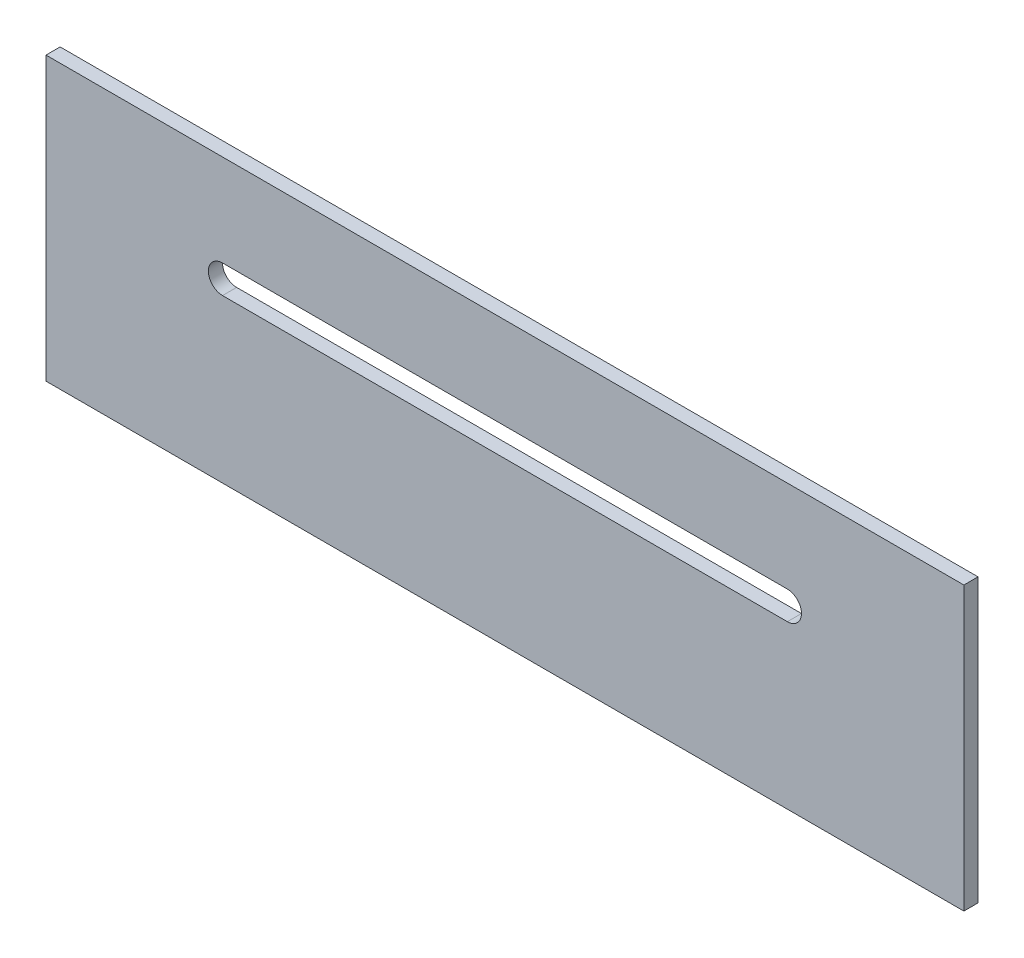
ISO-10303-21;
HEADER;
FILE_DESCRIPTION(('STEP AP214'),'2;1');
FILE_NAME('part.step','',(''),(''),'','','');
FILE_SCHEMA(('AUTOMOTIVE_DESIGN { 1 0 10303 214 1 1 1 1 }'));
ENDSEC;
DATA;
#1=APPLICATION_CONTEXT('core data for automotive mechanical design processes');
#2=APPLICATION_PROTOCOL_DEFINITION('international standard','automotive_design',2000,#1);
#3=PRODUCT_CONTEXT('',#1,'mechanical');
#4=PRODUCT('Part','Part','',(#3));
#5=PRODUCT_RELATED_PRODUCT_CATEGORY('part','',(#4));
#6=PRODUCT_DEFINITION_FORMATION('','',#4);
#7=PRODUCT_DEFINITION_CONTEXT('part definition',#1,'design');
#8=PRODUCT_DEFINITION('design','',#6,#7);
#9=PRODUCT_DEFINITION_SHAPE('','',#8);
#10=(LENGTH_UNIT() NAMED_UNIT(*) SI_UNIT(.MILLI.,.METRE.));
#11=(NAMED_UNIT(*) PLANE_ANGLE_UNIT() SI_UNIT($,.RADIAN.));
#12=(NAMED_UNIT(*) SI_UNIT($,.STERADIAN.) SOLID_ANGLE_UNIT());
#13=UNCERTAINTY_MEASURE_WITH_UNIT(LENGTH_MEASURE(1.E-05),#10,'distance_accuracy_value','');
#14=(GEOMETRIC_REPRESENTATION_CONTEXT(3) GLOBAL_UNCERTAINTY_ASSIGNED_CONTEXT((#13)) GLOBAL_UNIT_ASSIGNED_CONTEXT((#10,
#11,#12)) REPRESENTATION_CONTEXT('',''));
#15=CARTESIAN_POINT('',(0.,0.,0.));
#16=DIRECTION('',(0.,0.,1.));
#17=DIRECTION('',(1.,0.,0.));
#18=AXIS2_PLACEMENT_3D('',#15,#16,#17);
#19=CARTESIAN_POINT('',(65.,20.,2.));
#20=DIRECTION('',(-1.,0.,0.));
#21=DIRECTION('',(0.,-1.,0.));
#22=AXIS2_PLACEMENT_3D('',#19,#20,#21);
#23=PLANE('',#22);
#24=DIRECTION('',(0.,1.,0.));
#25=VECTOR('',#24,1.);
#26=CARTESIAN_POINT('',(65.,20.,0.));
#27=LINE('',#26,#25);
#28=CARTESIAN_POINT('',(65.,-20.,0.));
#29=VERTEX_POINT('',#28);
#30=CARTESIAN_POINT('',(65.,20.,0.));
#31=VERTEX_POINT('',#30);
#32=EDGE_CURVE('E147',#29,#31,#27,.T.);
#33=ORIENTED_EDGE('',*,*,#32,.T.);
#34=DIRECTION('',(0.,0.,-1.));
#35=VECTOR('',#34,1.);
#36=CARTESIAN_POINT('',(65.,20.,2.));
#37=LINE('',#36,#35);
#38=CARTESIAN_POINT('',(65.,20.,2.));
#39=VERTEX_POINT('',#38);
#40=EDGE_CURVE('E11',#39,#31,#37,.T.);
#41=ORIENTED_EDGE('',*,*,#40,.F.);
#42=DIRECTION('',(0.,1.,0.));
#43=VECTOR('',#42,1.);
#44=CARTESIAN_POINT('',(65.,20.,2.));
#45=LINE('',#44,#43);
#46=CARTESIAN_POINT('',(65.,-20.,2.));
#47=VERTEX_POINT('',#46);
#48=EDGE_CURVE('E153',#47,#39,#45,.T.);
#49=ORIENTED_EDGE('',*,*,#48,.F.);
#50=DIRECTION('',(0.,0.,-1.));
#51=VECTOR('',#50,1.);
#52=CARTESIAN_POINT('',(65.,-20.,2.));
#53=LINE('',#52,#51);
#54=EDGE_CURVE('E167',#47,#29,#53,.T.);
#55=ORIENTED_EDGE('',*,*,#54,.T.);
#56=EDGE_LOOP('',(#33,#41,#49,#55));
#57=FACE_BOUND('',#56,.T.);
#58=ADVANCED_FACE('F39',(#57),#23,.F.);
#59=CARTESIAN_POINT('',(-65.,20.,2.));
#60=DIRECTION('',(0.,-1.,0.));
#61=DIRECTION('',(0.,0.,-1.));
#62=AXIS2_PLACEMENT_3D('',#59,#60,#61);
#63=PLANE('',#62);
#64=DIRECTION('',(-1.,0.,0.));
#65=VECTOR('',#64,1.);
#66=CARTESIAN_POINT('',(-65.,20.,0.));
#67=LINE('',#66,#65);
#68=CARTESIAN_POINT('',(-65.,20.,0.));
#69=VERTEX_POINT('',#68);
#70=EDGE_CURVE('E171',#31,#69,#67,.T.);
#71=ORIENTED_EDGE('',*,*,#70,.T.);
#72=DIRECTION('',(0.,0.,-1.));
#73=VECTOR('',#72,1.);
#74=CARTESIAN_POINT('',(-65.,20.,2.));
#75=LINE('',#74,#73);
#76=CARTESIAN_POINT('',(-65.,20.,2.));
#77=VERTEX_POINT('',#76);
#78=EDGE_CURVE('E47',#77,#69,#75,.T.);
#79=ORIENTED_EDGE('',*,*,#78,.F.);
#80=DIRECTION('',(-1.,0.,0.));
#81=VECTOR('',#80,1.);
#82=CARTESIAN_POINT('',(-65.,20.,2.));
#83=LINE('',#82,#81);
#84=EDGE_CURVE('E157',#39,#77,#83,.T.);
#85=ORIENTED_EDGE('',*,*,#84,.F.);
#86=ORIENTED_EDGE('',*,*,#40,.T.);
#87=EDGE_LOOP('',(#71,#79,#85,#86));
#88=FACE_BOUND('',#87,.T.);
#89=ADVANCED_FACE('F205',(#88),#63,.F.);
#90=CARTESIAN_POINT('',(-65.,20.,2.));
#91=DIRECTION('',(1.,0.,0.));
#92=DIRECTION('',(0.,0.,-1.));
#93=AXIS2_PLACEMENT_3D('',#90,#91,#92);
#94=PLANE('',#93);
#95=DIRECTION('',(0.,-1.,0.));
#96=VECTOR('',#95,1.);
#97=CARTESIAN_POINT('',(-65.,20.,0.));
#98=LINE('',#97,#96);
#99=CARTESIAN_POINT('',(-65.,-20.,0.));
#100=VERTEX_POINT('',#99);
#101=EDGE_CURVE('E174',#69,#100,#98,.T.);
#102=ORIENTED_EDGE('',*,*,#101,.T.);
#103=DIRECTION('',(0.,0.,-1.));
#104=VECTOR('',#103,1.);
#105=CARTESIAN_POINT('',(-65.,-20.,2.));
#106=LINE('',#105,#104);
#107=CARTESIAN_POINT('',(-65.,-20.,2.));
#108=VERTEX_POINT('',#107);
#109=EDGE_CURVE('E182',#108,#100,#106,.T.);
#110=ORIENTED_EDGE('',*,*,#109,.F.);
#111=DIRECTION('',(0.,-1.,0.));
#112=VECTOR('',#111,1.);
#113=CARTESIAN_POINT('',(-65.,20.,2.));
#114=LINE('',#113,#112);
#115=EDGE_CURVE('E161',#77,#108,#114,.T.);
#116=ORIENTED_EDGE('',*,*,#115,.F.);
#117=ORIENTED_EDGE('',*,*,#78,.T.);
#118=EDGE_LOOP('',(#102,#110,#116,#117));
#119=FACE_BOUND('',#118,.T.);
#120=ADVANCED_FACE('F191',(#119),#94,.F.);
#121=CARTESIAN_POINT('',(-65.,-20.,2.));
#122=DIRECTION('',(0.,1.,0.));
#123=DIRECTION('',(0.,0.,1.));
#124=AXIS2_PLACEMENT_3D('',#121,#122,#123);
#125=PLANE('',#124);
#126=DIRECTION('',(1.,0.,0.));
#127=VECTOR('',#126,1.);
#128=CARTESIAN_POINT('',(-65.,-20.,0.));
#129=LINE('',#128,#127);
#130=EDGE_CURVE('E158',#100,#29,#129,.T.);
#131=ORIENTED_EDGE('',*,*,#130,.T.);
#132=ORIENTED_EDGE('',*,*,#54,.F.);
#133=DIRECTION('',(1.,0.,0.));
#134=VECTOR('',#133,1.);
#135=CARTESIAN_POINT('',(-65.,-20.,2.));
#136=LINE('',#135,#134);
#137=EDGE_CURVE('E164',#108,#47,#136,.T.);
#138=ORIENTED_EDGE('',*,*,#137,.F.);
#139=ORIENTED_EDGE('',*,*,#109,.T.);
#140=EDGE_LOOP('',(#131,#132,#138,#139));
#141=FACE_BOUND('',#140,.T.);
#142=ADVANCED_FACE('F198',(#141),#125,.F.);
#143=CARTESIAN_POINT('',(0.,0.,2.));
#144=DIRECTION('',(0.,0.,1.));
#145=DIRECTION('',(1.,0.,0.));
#146=AXIS2_PLACEMENT_3D('',#143,#144,#145);
#147=PLANE('',#146);
#148=CARTESIAN_POINT('',(-40.,5.,2.));
#149=DIRECTION('',(0.,0.,1.));
#150=DIRECTION('',(1.,0.,0.));
#151=AXIS2_PLACEMENT_3D('',#148,#149,#150);
#152=CIRCLE('',#151,2.);
#153=CARTESIAN_POINT('',(-40.,7.,2.));
#154=VERTEX_POINT('',#153);
#155=CARTESIAN_POINT('',(-40.,3.,2.));
#156=VERTEX_POINT('',#155);
#157=EDGE_CURVE('E54',#154,#156,#152,.T.);
#158=ORIENTED_EDGE('',*,*,#157,.F.);
#159=DIRECTION('',(-1.,0.,0.));
#160=VECTOR('',#159,1.);
#161=CARTESIAN_POINT('',(-40.,7.,2.));
#162=LINE('',#161,#160);
#163=CARTESIAN_POINT('',(40.,7.,2.));
#164=VERTEX_POINT('',#163);
#165=EDGE_CURVE('E125',#164,#154,#162,.T.);
#166=ORIENTED_EDGE('',*,*,#165,.F.);
#167=CARTESIAN_POINT('',(40.,5.,2.));
#168=DIRECTION('',(0.,0.,1.));
#169=DIRECTION('',(1.,0.,0.));
#170=AXIS2_PLACEMENT_3D('',#167,#168,#169);
#171=CIRCLE('',#170,2.);
#172=CARTESIAN_POINT('',(40.,3.,2.));
#173=VERTEX_POINT('',#172);
#174=EDGE_CURVE('E129',#173,#164,#171,.T.);
#175=ORIENTED_EDGE('',*,*,#174,.F.);
#176=DIRECTION('',(1.,0.,0.));
#177=VECTOR('',#176,1.);
#178=CARTESIAN_POINT('',(-40.,3.,2.));
#179=LINE('',#178,#177);
#180=EDGE_CURVE('E138',#156,#173,#179,.T.);
#181=ORIENTED_EDGE('',*,*,#180,.F.);
#182=EDGE_LOOP('',(#158,#166,#175,#181));
#183=FACE_BOUND('',#182,.T.);
#184=ORIENTED_EDGE('',*,*,#48,.T.);
#185=ORIENTED_EDGE('',*,*,#84,.T.);
#186=ORIENTED_EDGE('',*,*,#115,.T.);
#187=ORIENTED_EDGE('',*,*,#137,.T.);
#188=EDGE_LOOP('',(#184,#185,#186,#187));
#189=FACE_BOUND('',#188,.T.);
#190=ADVANCED_FACE('F204',(#183,#189),#147,.T.);
#191=CARTESIAN_POINT('',(0.,0.,0.));
#192=DIRECTION('',(0.,0.,1.));
#193=DIRECTION('',(1.,0.,0.));
#194=AXIS2_PLACEMENT_3D('',#191,#192,#193);
#195=PLANE('',#194);
#196=DIRECTION('',(-1.,0.,0.));
#197=VECTOR('',#196,1.);
#198=CARTESIAN_POINT('',(-40.,7.,0.));
#199=LINE('',#198,#197);
#200=CARTESIAN_POINT('',(40.,7.,0.));
#201=VERTEX_POINT('',#200);
#202=CARTESIAN_POINT('',(-40.,7.,0.));
#203=VERTEX_POINT('',#202);
#204=EDGE_CURVE('E113',#201,#203,#199,.T.);
#205=ORIENTED_EDGE('',*,*,#204,.T.);
#206=CARTESIAN_POINT('',(-40.,5.,0.));
#207=DIRECTION('',(0.,0.,1.));
#208=DIRECTION('',(1.,0.,0.));
#209=AXIS2_PLACEMENT_3D('',#206,#207,#208);
#210=CIRCLE('',#209,2.);
#211=CARTESIAN_POINT('',(-40.,3.,0.));
#212=VERTEX_POINT('',#211);
#213=EDGE_CURVE('E106',#203,#212,#210,.T.);
#214=ORIENTED_EDGE('',*,*,#213,.T.);
#215=DIRECTION('',(1.,0.,0.));
#216=VECTOR('',#215,1.);
#217=CARTESIAN_POINT('',(-40.,3.,0.));
#218=LINE('',#217,#216);
#219=CARTESIAN_POINT('',(40.,3.,0.));
#220=VERTEX_POINT('',#219);
#221=EDGE_CURVE('E116',#212,#220,#218,.T.);
#222=ORIENTED_EDGE('',*,*,#221,.T.);
#223=CARTESIAN_POINT('',(40.,5.,0.));
#224=DIRECTION('',(0.,0.,1.));
#225=DIRECTION('',(1.,0.,0.));
#226=AXIS2_PLACEMENT_3D('',#223,#224,#225);
#227=CIRCLE('',#226,2.);
#228=EDGE_CURVE('E62',#220,#201,#227,.T.);
#229=ORIENTED_EDGE('',*,*,#228,.T.);
#230=EDGE_LOOP('',(#205,#214,#222,#229));
#231=FACE_BOUND('',#230,.T.);
#232=ORIENTED_EDGE('',*,*,#32,.F.);
#233=ORIENTED_EDGE('',*,*,#130,.F.);
#234=ORIENTED_EDGE('',*,*,#101,.F.);
#235=ORIENTED_EDGE('',*,*,#70,.F.);
#236=EDGE_LOOP('',(#232,#233,#234,#235));
#237=FACE_BOUND('',#236,.T.);
#238=ADVANCED_FACE('F121',(#231,#237),#195,.F.);
#239=CARTESIAN_POINT('',(-40.,5.,0.));
#240=DIRECTION('',(0.,0.,1.));
#241=DIRECTION('',(1.,0.,0.));
#242=AXIS2_PLACEMENT_3D('',#239,#240,#241);
#243=CYLINDRICAL_SURFACE('',#242,2.);
#244=ORIENTED_EDGE('',*,*,#157,.T.);
#245=DIRECTION('',(0.,0.,1.));
#246=VECTOR('',#245,1.);
#247=CARTESIAN_POINT('',(-40.,3.,0.));
#248=LINE('',#247,#246);
#249=EDGE_CURVE('E102',#212,#156,#248,.T.);
#250=ORIENTED_EDGE('',*,*,#249,.F.);
#251=ORIENTED_EDGE('',*,*,#213,.F.);
#252=DIRECTION('',(0.,0.,1.));
#253=VECTOR('',#252,1.);
#254=CARTESIAN_POINT('',(-40.,7.,0.));
#255=LINE('',#254,#253);
#256=EDGE_CURVE('E144',#203,#154,#255,.T.);
#257=ORIENTED_EDGE('',*,*,#256,.T.);
#258=EDGE_LOOP('',(#244,#250,#251,#257));
#259=FACE_BOUND('',#258,.T.);
#260=ADVANCED_FACE('F104',(#259),#243,.F.);
#261=CARTESIAN_POINT('',(-40.,7.,0.));
#262=DIRECTION('',(0.,1.,0.));
#263=DIRECTION('',(0.,0.,1.));
#264=AXIS2_PLACEMENT_3D('',#261,#262,#263);
#265=PLANE('',#264);
#266=ORIENTED_EDGE('',*,*,#165,.T.);
#267=ORIENTED_EDGE('',*,*,#256,.F.);
#268=ORIENTED_EDGE('',*,*,#204,.F.);
#269=DIRECTION('',(0.,0.,1.));
#270=VECTOR('',#269,1.);
#271=CARTESIAN_POINT('',(40.,7.,0.));
#272=LINE('',#271,#270);
#273=EDGE_CURVE('E148',#201,#164,#272,.T.);
#274=ORIENTED_EDGE('',*,*,#273,.T.);
#275=EDGE_LOOP('',(#266,#267,#268,#274));
#276=FACE_BOUND('',#275,.T.);
#277=ADVANCED_FACE('F222',(#276),#265,.F.);
#278=CARTESIAN_POINT('',(40.,5.,0.));
#279=DIRECTION('',(0.,0.,1.));
#280=DIRECTION('',(1.,0.,0.));
#281=AXIS2_PLACEMENT_3D('',#278,#279,#280);
#282=CYLINDRICAL_SURFACE('',#281,2.);
#283=ORIENTED_EDGE('',*,*,#174,.T.);
#284=ORIENTED_EDGE('',*,*,#273,.F.);
#285=ORIENTED_EDGE('',*,*,#228,.F.);
#286=DIRECTION('',(0.,0.,1.));
#287=VECTOR('',#286,1.);
#288=CARTESIAN_POINT('',(40.,3.,0.));
#289=LINE('',#288,#287);
#290=EDGE_CURVE('E112',#220,#173,#289,.T.);
#291=ORIENTED_EDGE('',*,*,#290,.T.);
#292=EDGE_LOOP('',(#283,#284,#285,#291));
#293=FACE_BOUND('',#292,.T.);
#294=ADVANCED_FACE('F225',(#293),#282,.F.);
#295=CARTESIAN_POINT('',(-40.,3.,0.));
#296=DIRECTION('',(0.,-1.,0.));
#297=DIRECTION('',(0.,0.,-1.));
#298=AXIS2_PLACEMENT_3D('',#295,#296,#297);
#299=PLANE('',#298);
#300=ORIENTED_EDGE('',*,*,#180,.T.);
#301=ORIENTED_EDGE('',*,*,#290,.F.);
#302=ORIENTED_EDGE('',*,*,#221,.F.);
#303=ORIENTED_EDGE('',*,*,#249,.T.);
#304=EDGE_LOOP('',(#300,#301,#302,#303));
#305=FACE_BOUND('',#304,.T.);
#306=ADVANCED_FACE('F117',(#305),#299,.F.);
#307=CLOSED_SHELL('',(#58,#89,#120,#142,#190,#238,#260,#277,#294,#306));
#308=MANIFOLD_SOLID_BREP('B2',#307);
#309=ADVANCED_BREP_SHAPE_REPRESENTATION('',(#18,#308),#14);
#310=SHAPE_DEFINITION_REPRESENTATION(#9,#309);
ENDSEC;
END-ISO-10303-21;
